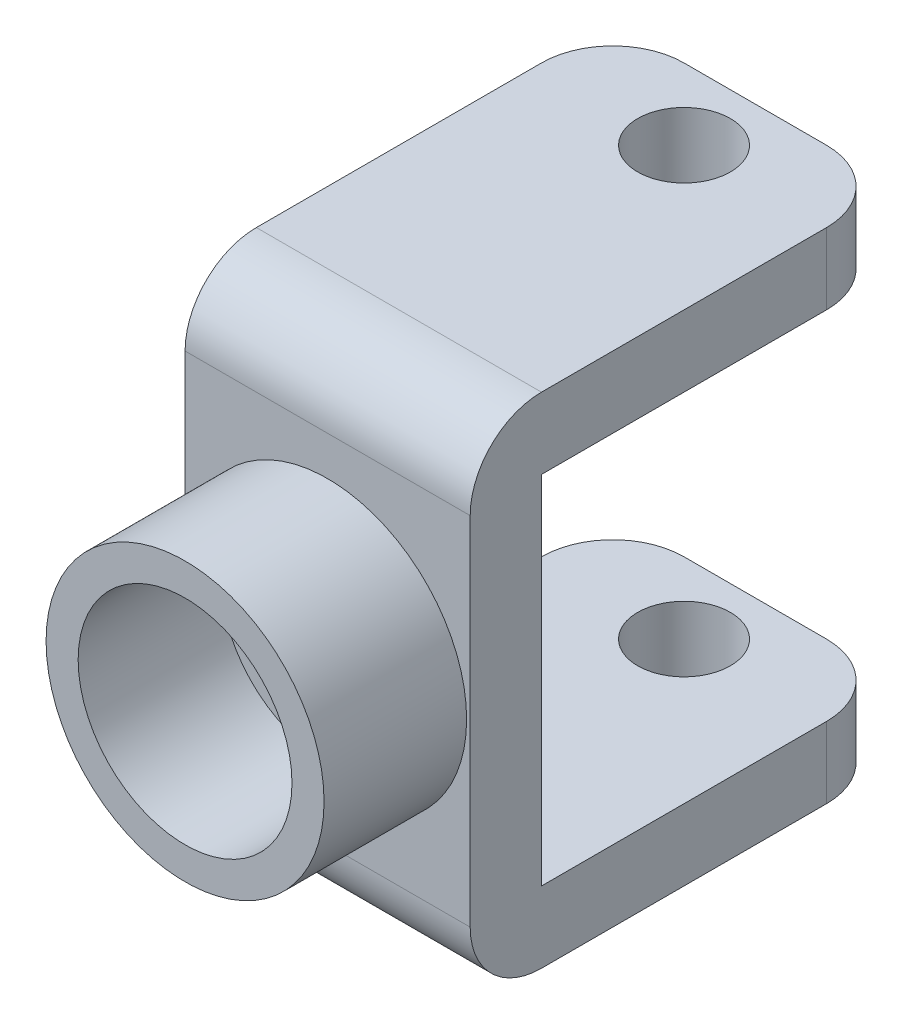
ISO-10303-21;
HEADER;
FILE_DESCRIPTION(('STEP AP214'),'2;1');
FILE_NAME('part.step','',(''),(''),'','','');
FILE_SCHEMA(('AUTOMOTIVE_DESIGN { 1 0 10303 214 1 1 1 1 }'));
ENDSEC;
DATA;
#1=APPLICATION_CONTEXT('core data for automotive mechanical design processes');
#2=APPLICATION_PROTOCOL_DEFINITION('international standard','automotive_design',2000,#1);
#3=PRODUCT_CONTEXT('',#1,'mechanical');
#4=PRODUCT('Part','Part','',(#3));
#5=PRODUCT_RELATED_PRODUCT_CATEGORY('part','',(#4));
#6=PRODUCT_DEFINITION_FORMATION('','',#4);
#7=PRODUCT_DEFINITION_CONTEXT('part definition',#1,'design');
#8=PRODUCT_DEFINITION('design','',#6,#7);
#9=PRODUCT_DEFINITION_SHAPE('','',#8);
#10=(LENGTH_UNIT() NAMED_UNIT(*) SI_UNIT(.MILLI.,.METRE.));
#11=(NAMED_UNIT(*) PLANE_ANGLE_UNIT() SI_UNIT($,.RADIAN.));
#12=(NAMED_UNIT(*) SI_UNIT($,.STERADIAN.) SOLID_ANGLE_UNIT());
#13=UNCERTAINTY_MEASURE_WITH_UNIT(LENGTH_MEASURE(1.E-05),#10,'distance_accuracy_value','');
#14=(GEOMETRIC_REPRESENTATION_CONTEXT(3) GLOBAL_UNCERTAINTY_ASSIGNED_CONTEXT((#13)) GLOBAL_UNIT_ASSIGNED_CONTEXT((#10,
#11,#12)) REPRESENTATION_CONTEXT('',''));
#15=CARTESIAN_POINT('',(0.,0.,0.));
#16=DIRECTION('',(0.,0.,1.));
#17=DIRECTION('',(1.,0.,0.));
#18=AXIS2_PLACEMENT_3D('',#15,#16,#17);
#19=CARTESIAN_POINT('',(0.,0.,0.));
#20=DIRECTION('',(0.,0.,1.));
#21=DIRECTION('',(1.,0.,0.));
#22=AXIS2_PLACEMENT_3D('',#19,#20,#21);
#23=PLANE('',#22);
#24=DIRECTION('',(1.,0.,0.));
#25=VECTOR('',#24,1.);
#26=CARTESIAN_POINT('',(0.,-25.,0.));
#27=LINE('',#26,#25);
#28=CARTESIAN_POINT('',(-20.,-25.,0.));
#29=VERTEX_POINT('',#28);
#30=CARTESIAN_POINT('',(20.,-25.,0.));
#31=VERTEX_POINT('',#30);
#32=EDGE_CURVE('E189',#29,#31,#27,.T.);
#33=ORIENTED_EDGE('',*,*,#32,.F.);
#34=DIRECTION('',(0.,1.,0.));
#35=VECTOR('',#34,1.);
#36=CARTESIAN_POINT('',(-20.,0.,0.));
#37=LINE('',#36,#35);
#38=CARTESIAN_POINT('',(-20.,25.,0.));
#39=VERTEX_POINT('',#38);
#40=EDGE_CURVE('E206',#29,#39,#37,.T.);
#41=ORIENTED_EDGE('',*,*,#40,.T.);
#42=DIRECTION('',(1.,0.,0.));
#43=VECTOR('',#42,1.);
#44=CARTESIAN_POINT('',(0.,25.,0.));
#45=LINE('',#44,#43);
#46=CARTESIAN_POINT('',(20.,25.,0.));
#47=VERTEX_POINT('',#46);
#48=EDGE_CURVE('E191',#39,#47,#45,.T.);
#49=ORIENTED_EDGE('',*,*,#48,.T.);
#50=DIRECTION('',(0.,1.,0.));
#51=VECTOR('',#50,1.);
#52=CARTESIAN_POINT('',(20.,0.,0.));
#53=LINE('',#52,#51);
#54=EDGE_CURVE('E176',#31,#47,#53,.T.);
#55=ORIENTED_EDGE('',*,*,#54,.F.);
#56=EDGE_LOOP('',(#33,#41,#49,#55));
#57=FACE_BOUND('',#56,.T.);
#58=ADVANCED_FACE('F67',(#57),#23,.F.);
#59=CARTESIAN_POINT('',(20.,0.,10.));
#60=DIRECTION('',(-1.,0.,0.));
#61=DIRECTION('',(0.,0.,1.));
#62=AXIS2_PLACEMENT_3D('',#59,#60,#61);
#63=PLANE('',#62);
#64=DIRECTION('',(0.,0.,1.));
#65=VECTOR('',#64,1.);
#66=CARTESIAN_POINT('',(20.,35.,10.));
#67=LINE('',#66,#65);
#68=CARTESIAN_POINT('',(20.,35.,-40.));
#69=VERTEX_POINT('',#68);
#70=CARTESIAN_POINT('',(20.,35.,0.));
#71=VERTEX_POINT('',#70);
#72=EDGE_CURVE('E266',#69,#71,#67,.T.);
#73=ORIENTED_EDGE('',*,*,#72,.T.);
#74=CARTESIAN_POINT('',(20.,25.,0.));
#75=DIRECTION('',(-1.,0.,0.));
#76=DIRECTION('',(0.,0.,1.));
#77=AXIS2_PLACEMENT_3D('',#74,#75,#76);
#78=CIRCLE('',#77,10.);
#79=CARTESIAN_POINT('',(20.,25.,10.));
#80=VERTEX_POINT('',#79);
#81=EDGE_CURVE('E234',#71,#80,#78,.F.);
#82=ORIENTED_EDGE('',*,*,#81,.T.);
#83=DIRECTION('',(0.,1.,0.));
#84=VECTOR('',#83,1.);
#85=CARTESIAN_POINT('',(20.,0.,10.));
#86=LINE('',#85,#84);
#87=CARTESIAN_POINT('',(20.,-25.,10.));
#88=VERTEX_POINT('',#87);
#89=EDGE_CURVE('E208',#88,#80,#86,.T.);
#90=ORIENTED_EDGE('',*,*,#89,.F.);
#91=CARTESIAN_POINT('',(20.,-25.,0.));
#92=DIRECTION('',(-1.,0.,0.));
#93=DIRECTION('',(0.,0.,1.));
#94=AXIS2_PLACEMENT_3D('',#91,#92,#93);
#95=CIRCLE('',#94,10.);
#96=CARTESIAN_POINT('',(20.,-35.,0.));
#97=VERTEX_POINT('',#96);
#98=EDGE_CURVE('E232',#88,#97,#95,.F.);
#99=ORIENTED_EDGE('',*,*,#98,.T.);
#100=DIRECTION('',(0.,0.,-1.));
#101=VECTOR('',#100,1.);
#102=CARTESIAN_POINT('',(20.,-35.,10.));
#103=LINE('',#102,#101);
#104=CARTESIAN_POINT('',(20.,-35.,-40.));
#105=VERTEX_POINT('',#104);
#106=EDGE_CURVE('E184',#97,#105,#103,.T.);
#107=ORIENTED_EDGE('',*,*,#106,.T.);
#108=DIRECTION('',(0.,1.,0.));
#109=VECTOR('',#108,1.);
#110=CARTESIAN_POINT('',(20.,0.,-40.));
#111=LINE('',#110,#109);
#112=CARTESIAN_POINT('',(20.,-25.,-40.));
#113=VERTEX_POINT('',#112);
#114=EDGE_CURVE('E180',#105,#113,#111,.T.);
#115=ORIENTED_EDGE('',*,*,#114,.T.);
#116=DIRECTION('',(0.,0.,1.));
#117=VECTOR('',#116,1.);
#118=CARTESIAN_POINT('',(20.,-25.,10.));
#119=LINE('',#118,#117);
#120=EDGE_CURVE('E171',#113,#31,#119,.T.);
#121=ORIENTED_EDGE('',*,*,#120,.T.);
#122=ORIENTED_EDGE('',*,*,#54,.T.);
#123=DIRECTION('',(0.,0.,-1.));
#124=VECTOR('',#123,1.);
#125=CARTESIAN_POINT('',(20.,25.,10.));
#126=LINE('',#125,#124);
#127=CARTESIAN_POINT('',(20.,25.,-40.));
#128=VERTEX_POINT('',#127);
#129=EDGE_CURVE('E260',#47,#128,#126,.T.);
#130=ORIENTED_EDGE('',*,*,#129,.T.);
#131=DIRECTION('',(0.,1.,0.));
#132=VECTOR('',#131,1.);
#133=CARTESIAN_POINT('',(20.,0.,-40.));
#134=LINE('',#133,#132);
#135=EDGE_CURVE('E228',#128,#69,#134,.T.);
#136=ORIENTED_EDGE('',*,*,#135,.T.);
#137=EDGE_LOOP('',(#73,#82,#90,#99,#107,#115,#121,#122,#130,#136));
#138=FACE_BOUND('',#137,.T.);
#139=ADVANCED_FACE('F174',(#138),#63,.F.);
#140=CARTESIAN_POINT('',(-20.,0.,10.));
#141=DIRECTION('',(-1.,0.,0.));
#142=DIRECTION('',(0.,0.,1.));
#143=AXIS2_PLACEMENT_3D('',#140,#141,#142);
#144=PLANE('',#143);
#145=DIRECTION('',(0.,1.,0.));
#146=VECTOR('',#145,1.);
#147=CARTESIAN_POINT('',(-20.,0.,10.));
#148=LINE('',#147,#146);
#149=CARTESIAN_POINT('',(-20.,-25.,10.));
#150=VERTEX_POINT('',#149);
#151=CARTESIAN_POINT('',(-20.,25.,10.));
#152=VERTEX_POINT('',#151);
#153=EDGE_CURVE('E202',#150,#152,#148,.T.);
#154=ORIENTED_EDGE('',*,*,#153,.T.);
#155=CARTESIAN_POINT('',(-20.,25.,0.));
#156=DIRECTION('',(-1.,0.,0.));
#157=DIRECTION('',(0.,0.,1.));
#158=AXIS2_PLACEMENT_3D('',#155,#156,#157);
#159=CIRCLE('',#158,10.);
#160=CARTESIAN_POINT('',(-20.,35.,0.));
#161=VERTEX_POINT('',#160);
#162=EDGE_CURVE('E220',#152,#161,#159,.T.);
#163=ORIENTED_EDGE('',*,*,#162,.T.);
#164=DIRECTION('',(0.,0.,1.));
#165=VECTOR('',#164,1.);
#166=CARTESIAN_POINT('',(-20.,35.,10.));
#167=LINE('',#166,#165);
#168=CARTESIAN_POINT('',(-20.,35.,-40.));
#169=VERTEX_POINT('',#168);
#170=EDGE_CURVE('E265',#169,#161,#167,.T.);
#171=ORIENTED_EDGE('',*,*,#170,.F.);
#172=DIRECTION('',(0.,1.,0.));
#173=VECTOR('',#172,1.);
#174=CARTESIAN_POINT('',(-20.,25.,-40.));
#175=LINE('',#174,#173);
#176=CARTESIAN_POINT('',(-20.,25.,-40.));
#177=VERTEX_POINT('',#176);
#178=EDGE_CURVE('E214',#169,#177,#175,.F.);
#179=ORIENTED_EDGE('',*,*,#178,.T.);
#180=DIRECTION('',(0.,0.,-1.));
#181=VECTOR('',#180,1.);
#182=CARTESIAN_POINT('',(-20.,25.,10.));
#183=LINE('',#182,#181);
#184=EDGE_CURVE('E281',#39,#177,#183,.T.);
#185=ORIENTED_EDGE('',*,*,#184,.F.);
#186=ORIENTED_EDGE('',*,*,#40,.F.);
#187=DIRECTION('',(0.,0.,1.));
#188=VECTOR('',#187,1.);
#189=CARTESIAN_POINT('',(-20.,-25.,10.));
#190=LINE('',#189,#188);
#191=CARTESIAN_POINT('',(-20.,-25.,-40.));
#192=VERTEX_POINT('',#191);
#193=EDGE_CURVE('E196',#192,#29,#190,.T.);
#194=ORIENTED_EDGE('',*,*,#193,.F.);
#195=DIRECTION('',(0.,1.,0.));
#196=VECTOR('',#195,1.);
#197=CARTESIAN_POINT('',(-20.,-35.,-40.));
#198=LINE('',#197,#196);
#199=CARTESIAN_POINT('',(-20.,-35.,-40.));
#200=VERTEX_POINT('',#199);
#201=EDGE_CURVE('E216',#192,#200,#198,.F.);
#202=ORIENTED_EDGE('',*,*,#201,.T.);
#203=DIRECTION('',(0.,0.,-1.));
#204=VECTOR('',#203,1.);
#205=CARTESIAN_POINT('',(-20.,-35.,10.));
#206=LINE('',#205,#204);
#207=CARTESIAN_POINT('',(-20.,-35.,0.));
#208=VERTEX_POINT('',#207);
#209=EDGE_CURVE('E282',#208,#200,#206,.T.);
#210=ORIENTED_EDGE('',*,*,#209,.F.);
#211=CARTESIAN_POINT('',(-20.,-25.,0.));
#212=DIRECTION('',(-1.,0.,0.));
#213=DIRECTION('',(0.,0.,1.));
#214=AXIS2_PLACEMENT_3D('',#211,#212,#213);
#215=CIRCLE('',#214,10.);
#216=EDGE_CURVE('E218',#208,#150,#215,.T.);
#217=ORIENTED_EDGE('',*,*,#216,.T.);
#218=EDGE_LOOP('',(#154,#163,#171,#179,#185,#186,#194,#202,#210,#217));
#219=FACE_BOUND('',#218,.T.);
#220=ADVANCED_FACE('F290',(#219),#144,.T.);
#221=CARTESIAN_POINT('',(0.,0.,10.));
#222=DIRECTION('',(0.,0.,1.));
#223=DIRECTION('',(1.,0.,0.));
#224=AXIS2_PLACEMENT_3D('',#221,#222,#223);
#225=PLANE('',#224);
#226=CARTESIAN_POINT('',(0.,0.,10.));
#227=DIRECTION('',(0.,0.,1.));
#228=DIRECTION('',(1.,0.,0.));
#229=AXIS2_PLACEMENT_3D('',#226,#227,#228);
#230=CIRCLE('',#229,19.5);
#231=CARTESIAN_POINT('',(19.5,0.,10.));
#232=VERTEX_POINT('',#231);
#233=EDGE_CURVE('E308',#232,#232,#230,.T.);
#234=ORIENTED_EDGE('',*,*,#233,.F.);
#235=EDGE_LOOP('',(#234));
#236=FACE_BOUND('',#235,.T.);
#237=ORIENTED_EDGE('',*,*,#89,.T.);
#238=DIRECTION('',(-1.,0.,0.));
#239=VECTOR('',#238,1.);
#240=CARTESIAN_POINT('',(-20.,25.,10.));
#241=LINE('',#240,#239);
#242=EDGE_CURVE('E211',#80,#152,#241,.T.);
#243=ORIENTED_EDGE('',*,*,#242,.T.);
#244=ORIENTED_EDGE('',*,*,#153,.F.);
#245=DIRECTION('',(-1.,0.,0.));
#246=VECTOR('',#245,1.);
#247=CARTESIAN_POINT('',(20.,-25.,10.));
#248=LINE('',#247,#246);
#249=EDGE_CURVE('E209',#150,#88,#248,.F.);
#250=ORIENTED_EDGE('',*,*,#249,.T.);
#251=EDGE_LOOP('',(#237,#243,#244,#250));
#252=FACE_BOUND('',#251,.T.);
#253=ADVANCED_FACE('F294',(#236,#252),#225,.T.);
#254=CARTESIAN_POINT('',(20.,-25.,10.));
#255=DIRECTION('',(0.,-1.,0.));
#256=DIRECTION('',(0.,0.,-1.));
#257=AXIS2_PLACEMENT_3D('',#254,#255,#256);
#258=PLANE('',#257);
#259=CARTESIAN_POINT('',(0.,-25.,-40.));
#260=DIRECTION('',(0.,-1.,0.));
#261=DIRECTION('',(0.,0.,-1.));
#262=AXIS2_PLACEMENT_3D('',#259,#260,#261);
#263=CIRCLE('',#262,6.5);
#264=CARTESIAN_POINT('',(0.,-25.,-46.5));
#265=VERTEX_POINT('',#264);
#266=EDGE_CURVE('E464',#265,#265,#263,.T.);
#267=ORIENTED_EDGE('',*,*,#266,.T.);
#268=EDGE_LOOP('',(#267));
#269=FACE_BOUND('',#268,.T.);
#270=DIRECTION('',(-1.,0.,0.));
#271=VECTOR('',#270,1.);
#272=CARTESIAN_POINT('',(20.,-25.,-50.));
#273=LINE('',#272,#271);
#274=CARTESIAN_POINT('',(10.,-25.,-50.));
#275=VERTEX_POINT('',#274);
#276=CARTESIAN_POINT('',(-10.,-25.,-50.));
#277=VERTEX_POINT('',#276);
#278=EDGE_CURVE('E183',#275,#277,#273,.T.);
#279=ORIENTED_EDGE('',*,*,#278,.T.);
#280=CARTESIAN_POINT('',(-10.,-25.,-40.));
#281=DIRECTION('',(0.,-1.,0.));
#282=DIRECTION('',(0.,0.,-1.));
#283=AXIS2_PLACEMENT_3D('',#280,#281,#282);
#284=CIRCLE('',#283,10.);
#285=EDGE_CURVE('E250',#277,#192,#284,.F.);
#286=ORIENTED_EDGE('',*,*,#285,.T.);
#287=ORIENTED_EDGE('',*,*,#193,.T.);
#288=ORIENTED_EDGE('',*,*,#32,.T.);
#289=ORIENTED_EDGE('',*,*,#120,.F.);
#290=CARTESIAN_POINT('',(10.,-25.,-40.));
#291=DIRECTION('',(0.,-1.,0.));
#292=DIRECTION('',(0.,0.,-1.));
#293=AXIS2_PLACEMENT_3D('',#290,#291,#292);
#294=CIRCLE('',#293,10.);
#295=EDGE_CURVE('E248',#113,#275,#294,.F.);
#296=ORIENTED_EDGE('',*,*,#295,.T.);
#297=EDGE_LOOP('',(#279,#286,#287,#288,#289,#296));
#298=FACE_BOUND('',#297,.T.);
#299=ADVANCED_FACE('F194',(#269,#298),#258,.F.);
#300=CARTESIAN_POINT('',(20.,-35.,10.));
#301=DIRECTION('',(0.,1.,0.));
#302=DIRECTION('',(0.,0.,1.));
#303=AXIS2_PLACEMENT_3D('',#300,#301,#302);
#304=PLANE('',#303);
#305=CARTESIAN_POINT('',(0.,-35.,-40.));
#306=DIRECTION('',(0.,-1.,0.));
#307=DIRECTION('',(0.,0.,-1.));
#308=AXIS2_PLACEMENT_3D('',#305,#306,#307);
#309=CIRCLE('',#308,6.5);
#310=CARTESIAN_POINT('',(0.,-35.,-46.5));
#311=VERTEX_POINT('',#310);
#312=EDGE_CURVE('E462',#311,#311,#309,.T.);
#313=ORIENTED_EDGE('',*,*,#312,.F.);
#314=EDGE_LOOP('',(#313));
#315=FACE_BOUND('',#314,.T.);
#316=ORIENTED_EDGE('',*,*,#106,.F.);
#317=DIRECTION('',(-1.,0.,0.));
#318=VECTOR('',#317,1.);
#319=CARTESIAN_POINT('',(-20.,-35.,0.));
#320=LINE('',#319,#318);
#321=EDGE_CURVE('E240',#97,#208,#320,.T.);
#322=ORIENTED_EDGE('',*,*,#321,.T.);
#323=ORIENTED_EDGE('',*,*,#209,.T.);
#324=CARTESIAN_POINT('',(-10.,-35.,-40.));
#325=DIRECTION('',(0.,1.,0.));
#326=DIRECTION('',(0.,0.,1.));
#327=AXIS2_PLACEMENT_3D('',#324,#325,#326);
#328=CIRCLE('',#327,10.);
#329=CARTESIAN_POINT('',(-10.,-35.,-50.));
#330=VERTEX_POINT('',#329);
#331=EDGE_CURVE('E238',#200,#330,#328,.F.);
#332=ORIENTED_EDGE('',*,*,#331,.T.);
#333=DIRECTION('',(-1.,0.,0.));
#334=VECTOR('',#333,1.);
#335=CARTESIAN_POINT('',(20.,-35.,-50.));
#336=LINE('',#335,#334);
#337=CARTESIAN_POINT('',(10.,-35.,-50.));
#338=VERTEX_POINT('',#337);
#339=EDGE_CURVE('E197',#338,#330,#336,.T.);
#340=ORIENTED_EDGE('',*,*,#339,.F.);
#341=CARTESIAN_POINT('',(10.,-35.,-40.));
#342=DIRECTION('',(0.,1.,0.));
#343=DIRECTION('',(0.,0.,1.));
#344=AXIS2_PLACEMENT_3D('',#341,#342,#343);
#345=CIRCLE('',#344,10.);
#346=EDGE_CURVE('E236',#338,#105,#345,.F.);
#347=ORIENTED_EDGE('',*,*,#346,.T.);
#348=EDGE_LOOP('',(#316,#322,#323,#332,#340,#347));
#349=FACE_BOUND('',#348,.T.);
#350=ADVANCED_FACE('F301',(#315,#349),#304,.F.);
#351=CARTESIAN_POINT('',(20.,-25.,-50.));
#352=DIRECTION('',(0.,0.,1.));
#353=DIRECTION('',(0.,-1.,0.));
#354=AXIS2_PLACEMENT_3D('',#351,#352,#353);
#355=PLANE('',#354);
#356=ORIENTED_EDGE('',*,*,#339,.T.);
#357=DIRECTION('',(0.,1.,0.));
#358=VECTOR('',#357,1.);
#359=CARTESIAN_POINT('',(-10.,-25.,-50.));
#360=LINE('',#359,#358);
#361=EDGE_CURVE('E245',#330,#277,#360,.T.);
#362=ORIENTED_EDGE('',*,*,#361,.T.);
#363=ORIENTED_EDGE('',*,*,#278,.F.);
#364=DIRECTION('',(0.,1.,0.));
#365=VECTOR('',#364,1.);
#366=CARTESIAN_POINT('',(10.,-25.,-50.));
#367=LINE('',#366,#365);
#368=EDGE_CURVE('E243',#275,#338,#367,.F.);
#369=ORIENTED_EDGE('',*,*,#368,.T.);
#370=EDGE_LOOP('',(#356,#362,#363,#369));
#371=FACE_BOUND('',#370,.T.);
#372=ADVANCED_FACE('F315',(#371),#355,.F.);
#373=CARTESIAN_POINT('',(20.,25.,10.));
#374=DIRECTION('',(0.,1.,0.));
#375=DIRECTION('',(0.,0.,1.));
#376=AXIS2_PLACEMENT_3D('',#373,#374,#375);
#377=PLANE('',#376);
#378=CARTESIAN_POINT('',(0.,25.,-40.));
#379=DIRECTION('',(0.,1.,0.));
#380=DIRECTION('',(0.,0.,1.));
#381=AXIS2_PLACEMENT_3D('',#378,#379,#380);
#382=CIRCLE('',#381,6.5);
#383=CARTESIAN_POINT('',(0.,25.,-33.5));
#384=VERTEX_POINT('',#383);
#385=EDGE_CURVE('E461',#384,#384,#382,.T.);
#386=ORIENTED_EDGE('',*,*,#385,.T.);
#387=EDGE_LOOP('',(#386));
#388=FACE_BOUND('',#387,.T.);
#389=ORIENTED_EDGE('',*,*,#184,.T.);
#390=CARTESIAN_POINT('',(-10.,25.,-40.));
#391=DIRECTION('',(0.,1.,0.));
#392=DIRECTION('',(0.,0.,1.));
#393=AXIS2_PLACEMENT_3D('',#390,#391,#392);
#394=CIRCLE('',#393,10.);
#395=CARTESIAN_POINT('',(-10.,25.,-50.));
#396=VERTEX_POINT('',#395);
#397=EDGE_CURVE('E76',#177,#396,#394,.F.);
#398=ORIENTED_EDGE('',*,*,#397,.T.);
#399=DIRECTION('',(-1.,0.,0.));
#400=VECTOR('',#399,1.);
#401=CARTESIAN_POINT('',(20.,25.,-50.));
#402=LINE('',#401,#400);
#403=CARTESIAN_POINT('',(10.,25.,-50.));
#404=VERTEX_POINT('',#403);
#405=EDGE_CURVE('E261',#404,#396,#402,.T.);
#406=ORIENTED_EDGE('',*,*,#405,.F.);
#407=CARTESIAN_POINT('',(10.,25.,-40.));
#408=DIRECTION('',(0.,1.,0.));
#409=DIRECTION('',(0.,0.,1.));
#410=AXIS2_PLACEMENT_3D('',#407,#408,#409);
#411=CIRCLE('',#410,10.);
#412=EDGE_CURVE('E256',#404,#128,#411,.F.);
#413=ORIENTED_EDGE('',*,*,#412,.T.);
#414=ORIENTED_EDGE('',*,*,#129,.F.);
#415=ORIENTED_EDGE('',*,*,#48,.F.);
#416=EDGE_LOOP('',(#389,#398,#406,#413,#414,#415));
#417=FACE_BOUND('',#416,.T.);
#418=ADVANCED_FACE('F259',(#388,#417),#377,.F.);
#419=CARTESIAN_POINT('',(20.,25.,-50.));
#420=DIRECTION('',(0.,0.,1.));
#421=DIRECTION('',(1.,0.,0.));
#422=AXIS2_PLACEMENT_3D('',#419,#420,#421);
#423=PLANE('',#422);
#424=ORIENTED_EDGE('',*,*,#405,.T.);
#425=DIRECTION('',(0.,1.,0.));
#426=VECTOR('',#425,1.);
#427=CARTESIAN_POINT('',(-10.,35.,-50.));
#428=LINE('',#427,#426);
#429=CARTESIAN_POINT('',(-10.,35.,-50.));
#430=VERTEX_POINT('',#429);
#431=EDGE_CURVE('E253',#396,#430,#428,.T.);
#432=ORIENTED_EDGE('',*,*,#431,.T.);
#433=DIRECTION('',(-1.,0.,0.));
#434=VECTOR('',#433,1.);
#435=CARTESIAN_POINT('',(20.,35.,-50.));
#436=LINE('',#435,#434);
#437=CARTESIAN_POINT('',(10.,35.,-50.));
#438=VERTEX_POINT('',#437);
#439=EDGE_CURVE('E272',#438,#430,#436,.T.);
#440=ORIENTED_EDGE('',*,*,#439,.F.);
#441=DIRECTION('',(0.,1.,0.));
#442=VECTOR('',#441,1.);
#443=CARTESIAN_POINT('',(10.,25.,-50.));
#444=LINE('',#443,#442);
#445=EDGE_CURVE('E89',#438,#404,#444,.F.);
#446=ORIENTED_EDGE('',*,*,#445,.T.);
#447=EDGE_LOOP('',(#424,#432,#440,#446));
#448=FACE_BOUND('',#447,.T.);
#449=ADVANCED_FACE('F273',(#448),#423,.F.);
#450=CARTESIAN_POINT('',(20.,35.,10.));
#451=DIRECTION('',(0.,-1.,0.));
#452=DIRECTION('',(0.,0.,-1.));
#453=AXIS2_PLACEMENT_3D('',#450,#451,#452);
#454=PLANE('',#453);
#455=CARTESIAN_POINT('',(0.,35.,-40.));
#456=DIRECTION('',(0.,-1.,0.));
#457=DIRECTION('',(0.,0.,-1.));
#458=AXIS2_PLACEMENT_3D('',#455,#456,#457);
#459=CIRCLE('',#458,6.5);
#460=CARTESIAN_POINT('',(0.,35.,-46.5));
#461=VERTEX_POINT('',#460);
#462=EDGE_CURVE('E71',#461,#461,#459,.T.);
#463=ORIENTED_EDGE('',*,*,#462,.T.);
#464=EDGE_LOOP('',(#463));
#465=FACE_BOUND('',#464,.T.);
#466=ORIENTED_EDGE('',*,*,#170,.T.);
#467=DIRECTION('',(-1.,0.,0.));
#468=VECTOR('',#467,1.);
#469=CARTESIAN_POINT('',(20.,35.,0.));
#470=LINE('',#469,#468);
#471=EDGE_CURVE('E226',#161,#71,#470,.F.);
#472=ORIENTED_EDGE('',*,*,#471,.T.);
#473=ORIENTED_EDGE('',*,*,#72,.F.);
#474=CARTESIAN_POINT('',(10.,35.,-40.));
#475=DIRECTION('',(0.,-1.,0.));
#476=DIRECTION('',(0.,0.,-1.));
#477=AXIS2_PLACEMENT_3D('',#474,#475,#476);
#478=CIRCLE('',#477,10.);
#479=EDGE_CURVE('E222',#69,#438,#478,.F.);
#480=ORIENTED_EDGE('',*,*,#479,.T.);
#481=ORIENTED_EDGE('',*,*,#439,.T.);
#482=CARTESIAN_POINT('',(-10.,35.,-40.));
#483=DIRECTION('',(0.,-1.,0.));
#484=DIRECTION('',(0.,0.,-1.));
#485=AXIS2_PLACEMENT_3D('',#482,#483,#484);
#486=CIRCLE('',#485,10.);
#487=EDGE_CURVE('E224',#430,#169,#486,.F.);
#488=ORIENTED_EDGE('',*,*,#487,.T.);
#489=EDGE_LOOP('',(#466,#472,#473,#480,#481,#488));
#490=FACE_BOUND('',#489,.T.);
#491=ADVANCED_FACE('F271',(#465,#490),#454,.F.);
#492=CARTESIAN_POINT('',(0.,25.,0.));
#493=DIRECTION('',(1.,0.,0.));
#494=DIRECTION('',(0.,0.,-1.));
#495=AXIS2_PLACEMENT_3D('',#492,#493,#494);
#496=CYLINDRICAL_SURFACE('',#495,10.);
#497=ORIENTED_EDGE('',*,*,#81,.F.);
#498=ORIENTED_EDGE('',*,*,#471,.F.);
#499=ORIENTED_EDGE('',*,*,#162,.F.);
#500=ORIENTED_EDGE('',*,*,#242,.F.);
#501=EDGE_LOOP('',(#497,#498,#499,#500));
#502=FACE_BOUND('',#501,.T.);
#503=ADVANCED_FACE('F341',(#502),#496,.T.);
#504=CARTESIAN_POINT('',(20.,-25.,0.));
#505=DIRECTION('',(1.,0.,0.));
#506=DIRECTION('',(0.,0.,-1.));
#507=AXIS2_PLACEMENT_3D('',#504,#505,#506);
#508=CYLINDRICAL_SURFACE('',#507,10.);
#509=ORIENTED_EDGE('',*,*,#98,.F.);
#510=ORIENTED_EDGE('',*,*,#249,.F.);
#511=ORIENTED_EDGE('',*,*,#216,.F.);
#512=ORIENTED_EDGE('',*,*,#321,.F.);
#513=EDGE_LOOP('',(#509,#510,#511,#512));
#514=FACE_BOUND('',#513,.T.);
#515=ADVANCED_FACE('F297',(#514),#508,.T.);
#516=CARTESIAN_POINT('',(-10.,-25.,-40.));
#517=DIRECTION('',(0.,-1.,0.));
#518=DIRECTION('',(0.,0.,-1.));
#519=AXIS2_PLACEMENT_3D('',#516,#517,#518);
#520=CYLINDRICAL_SURFACE('',#519,10.);
#521=ORIENTED_EDGE('',*,*,#331,.F.);
#522=ORIENTED_EDGE('',*,*,#201,.F.);
#523=ORIENTED_EDGE('',*,*,#285,.F.);
#524=ORIENTED_EDGE('',*,*,#361,.F.);
#525=EDGE_LOOP('',(#521,#522,#523,#524));
#526=FACE_BOUND('',#525,.T.);
#527=ADVANCED_FACE('F321',(#526),#520,.T.);
#528=CARTESIAN_POINT('',(10.,0.,-40.));
#529=DIRECTION('',(0.,1.,0.));
#530=DIRECTION('',(0.,0.,1.));
#531=AXIS2_PLACEMENT_3D('',#528,#529,#530);
#532=CYLINDRICAL_SURFACE('',#531,10.);
#533=ORIENTED_EDGE('',*,*,#346,.F.);
#534=ORIENTED_EDGE('',*,*,#368,.F.);
#535=ORIENTED_EDGE('',*,*,#295,.F.);
#536=ORIENTED_EDGE('',*,*,#114,.F.);
#537=EDGE_LOOP('',(#533,#534,#535,#536));
#538=FACE_BOUND('',#537,.T.);
#539=ADVANCED_FACE('F318',(#538),#532,.T.);
#540=CARTESIAN_POINT('',(-10.,25.,-40.));
#541=DIRECTION('',(0.,-1.,0.));
#542=DIRECTION('',(0.,0.,-1.));
#543=AXIS2_PLACEMENT_3D('',#540,#541,#542);
#544=CYLINDRICAL_SURFACE('',#543,10.);
#545=ORIENTED_EDGE('',*,*,#397,.F.);
#546=ORIENTED_EDGE('',*,*,#178,.F.);
#547=ORIENTED_EDGE('',*,*,#487,.F.);
#548=ORIENTED_EDGE('',*,*,#431,.F.);
#549=EDGE_LOOP('',(#545,#546,#547,#548));
#550=FACE_BOUND('',#549,.T.);
#551=ADVANCED_FACE('F320',(#550),#544,.T.);
#552=CARTESIAN_POINT('',(10.,0.,-40.));
#553=DIRECTION('',(0.,1.,0.));
#554=DIRECTION('',(0.,0.,1.));
#555=AXIS2_PLACEMENT_3D('',#552,#553,#554);
#556=CYLINDRICAL_SURFACE('',#555,10.);
#557=ORIENTED_EDGE('',*,*,#412,.F.);
#558=ORIENTED_EDGE('',*,*,#445,.F.);
#559=ORIENTED_EDGE('',*,*,#479,.F.);
#560=ORIENTED_EDGE('',*,*,#135,.F.);
#561=EDGE_LOOP('',(#557,#558,#559,#560));
#562=FACE_BOUND('',#561,.T.);
#563=ADVANCED_FACE('F69',(#562),#556,.T.);
#564=CARTESIAN_POINT('',(0.,0.,30.));
#565=DIRECTION('',(0.,0.,1.));
#566=DIRECTION('',(1.,0.,0.));
#567=AXIS2_PLACEMENT_3D('',#564,#565,#566);
#568=PLANE('',#567);
#569=CARTESIAN_POINT('',(0.,0.,30.));
#570=DIRECTION('',(0.,0.,1.));
#571=DIRECTION('',(1.,0.,0.));
#572=AXIS2_PLACEMENT_3D('',#569,#570,#571);
#573=CIRCLE('',#572,19.5);
#574=CARTESIAN_POINT('',(19.5,0.,30.));
#575=VERTEX_POINT('',#574);
#576=EDGE_CURVE('E277',#575,#575,#573,.T.);
#577=ORIENTED_EDGE('',*,*,#576,.T.);
#578=EDGE_LOOP('',(#577));
#579=FACE_BOUND('',#578,.T.);
#580=CARTESIAN_POINT('',(0.,0.,30.));
#581=DIRECTION('',(0.,0.,1.));
#582=DIRECTION('',(1.,0.,0.));
#583=AXIS2_PLACEMENT_3D('',#580,#581,#582);
#584=CIRCLE('',#583,15.);
#585=CARTESIAN_POINT('',(15.,0.,30.));
#586=VERTEX_POINT('',#585);
#587=EDGE_CURVE('E471',#586,#586,#584,.T.);
#588=ORIENTED_EDGE('',*,*,#587,.F.);
#589=EDGE_LOOP('',(#588));
#590=FACE_BOUND('',#589,.T.);
#591=ADVANCED_FACE('F376',(#579,#590),#568,.T.);
#592=CARTESIAN_POINT('',(0.,0.,30.));
#593=DIRECTION('',(0.,0.,-1.));
#594=DIRECTION('',(-1.,0.,0.));
#595=AXIS2_PLACEMENT_3D('',#592,#593,#594);
#596=CYLINDRICAL_SURFACE('',#595,19.5);
#597=ORIENTED_EDGE('',*,*,#576,.F.);
#598=EDGE_LOOP('',(#597));
#599=FACE_BOUND('',#598,.T.);
#600=ORIENTED_EDGE('',*,*,#233,.T.);
#601=EDGE_LOOP('',(#600));
#602=FACE_BOUND('',#601,.T.);
#603=ADVANCED_FACE('F401',(#599,#602),#596,.T.);
#604=CARTESIAN_POINT('',(0.,0.,30.));
#605=DIRECTION('',(0.,0.,-1.));
#606=DIRECTION('',(-1.,0.,0.));
#607=AXIS2_PLACEMENT_3D('',#604,#605,#606);
#608=CYLINDRICAL_SURFACE('',#607,15.);
#609=ORIENTED_EDGE('',*,*,#587,.T.);
#610=EDGE_LOOP('',(#609));
#611=FACE_BOUND('',#610,.T.);
#612=CARTESIAN_POINT('',(0.,0.,10.));
#613=DIRECTION('',(0.,0.,1.));
#614=DIRECTION('',(1.,0.,0.));
#615=AXIS2_PLACEMENT_3D('',#612,#613,#614);
#616=CIRCLE('',#615,15.);
#617=CARTESIAN_POINT('',(15.,0.,10.));
#618=VERTEX_POINT('',#617);
#619=EDGE_CURVE('E12',#618,#618,#616,.F.);
#620=ORIENTED_EDGE('',*,*,#619,.T.);
#621=EDGE_LOOP('',(#620));
#622=FACE_BOUND('',#621,.T.);
#623=ADVANCED_FACE('F387',(#611,#622),#608,.F.);
#624=ORIENTED_EDGE('',*,*,#619,.F.);
#625=EDGE_LOOP('',(#624));
#626=FACE_BOUND('',#625,.T.);
#627=ADVANCED_FACE('F381',(#626),#225,.T.);
#628=CARTESIAN_POINT('',(0.,65.,-40.));
#629=DIRECTION('',(0.,-1.,0.));
#630=DIRECTION('',(0.,0.,-1.));
#631=AXIS2_PLACEMENT_3D('',#628,#629,#630);
#632=CYLINDRICAL_SURFACE('',#631,6.5);
#633=ORIENTED_EDGE('',*,*,#462,.F.);
#634=EDGE_LOOP('',(#633));
#635=FACE_BOUND('',#634,.T.);
#636=ORIENTED_EDGE('',*,*,#385,.F.);
#637=EDGE_LOOP('',(#636));
#638=FACE_BOUND('',#637,.T.);
#639=ADVANCED_FACE('F386',(#635,#638),#632,.F.);
#640=ORIENTED_EDGE('',*,*,#312,.T.);
#641=EDGE_LOOP('',(#640));
#642=FACE_BOUND('',#641,.T.);
#643=ORIENTED_EDGE('',*,*,#266,.F.);
#644=EDGE_LOOP('',(#643));
#645=FACE_BOUND('',#644,.T.);
#646=ADVANCED_FACE('F429',(#642,#645),#632,.F.);
#647=CLOSED_SHELL('',(#58,#139,#220,#253,#299,#350,#372,#418,#449,#491,#503,#515,#527,#539,#551,
#563,#591,#603,#623,#627,#639,#646));
#648=MANIFOLD_SOLID_BREP('B2',#647);
#649=ADVANCED_BREP_SHAPE_REPRESENTATION('',(#18,#648),#14);
#650=SHAPE_DEFINITION_REPRESENTATION(#9,#649);
ENDSEC;
END-ISO-10303-21;
